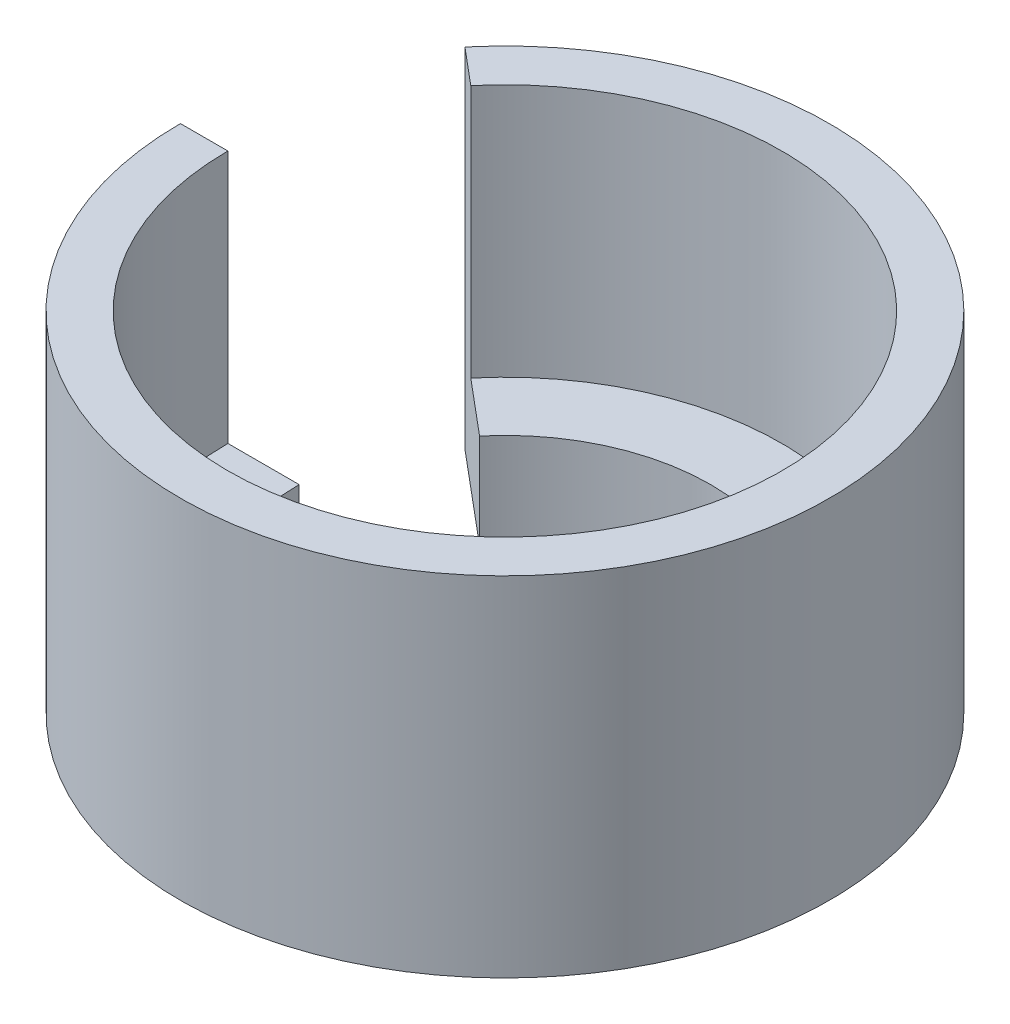
ISO-10303-21;
HEADER;
FILE_DESCRIPTION(('STEP AP214'),'2;1');
FILE_NAME('part.step','',(''),(''),'','','');
FILE_SCHEMA(('AUTOMOTIVE_DESIGN { 1 0 10303 214 1 1 1 1 }'));
ENDSEC;
DATA;
#1=APPLICATION_CONTEXT('core data for automotive mechanical design processes');
#2=APPLICATION_PROTOCOL_DEFINITION('international standard','automotive_design',2000,#1);
#3=PRODUCT_CONTEXT('',#1,'mechanical');
#4=PRODUCT('Part','Part','',(#3));
#5=PRODUCT_RELATED_PRODUCT_CATEGORY('part','',(#4));
#6=PRODUCT_DEFINITION_FORMATION('','',#4);
#7=PRODUCT_DEFINITION_CONTEXT('part definition',#1,'design');
#8=PRODUCT_DEFINITION('design','',#6,#7);
#9=PRODUCT_DEFINITION_SHAPE('','',#8);
#10=(LENGTH_UNIT() NAMED_UNIT(*) SI_UNIT(.MILLI.,.METRE.));
#11=(NAMED_UNIT(*) PLANE_ANGLE_UNIT() SI_UNIT($,.RADIAN.));
#12=(NAMED_UNIT(*) SI_UNIT($,.STERADIAN.) SOLID_ANGLE_UNIT());
#13=UNCERTAINTY_MEASURE_WITH_UNIT(LENGTH_MEASURE(1.E-05),#10,'distance_accuracy_value','');
#14=(GEOMETRIC_REPRESENTATION_CONTEXT(3) GLOBAL_UNCERTAINTY_ASSIGNED_CONTEXT((#13)) GLOBAL_UNIT_ASSIGNED_CONTEXT((#10,
#11,#12)) REPRESENTATION_CONTEXT('',''));
#15=CARTESIAN_POINT('',(0.,0.,0.));
#16=DIRECTION('',(0.,0.,1.));
#17=DIRECTION('',(1.,0.,0.));
#18=AXIS2_PLACEMENT_3D('',#15,#16,#17);
#19=CARTESIAN_POINT('',(-2.68115555091645,1.2,-2.24975663390286));
#20=DIRECTION('',(0.,-1.,0.));
#21=DIRECTION('',(0.,0.,-1.));
#22=AXIS2_PLACEMENT_3D('',#19,#20,#21);
#23=PLANE('',#22);
#24=CARTESIAN_POINT('',(0.,1.2,0.));
#25=DIRECTION('',(0.,-1.,0.));
#26=DIRECTION('',(0.,0.,-1.));
#27=AXIS2_PLACEMENT_3D('',#24,#25,#26);
#28=CIRCLE('',#27,2.6);
#29=CARTESIAN_POINT('',(-1.99171555210936,1.2,-1.67124778518498));
#30=VERTEX_POINT('',#29);
#31=CARTESIAN_POINT('',(-2.6,1.2,0.));
#32=VERTEX_POINT('',#31);
#33=EDGE_CURVE('E11',#30,#32,#28,.T.);
#34=ORIENTED_EDGE('',*,*,#33,.T.);
#35=DIRECTION('',(-1.,0.,0.));
#36=VECTOR('',#35,1.);
#37=CARTESIAN_POINT('',(-3.5,1.2,0.));
#38=LINE('',#37,#36);
#39=CARTESIAN_POINT('',(-3.5,1.2,0.));
#40=VERTEX_POINT('',#39);
#41=EDGE_CURVE('E100',#32,#40,#38,.T.);
#42=ORIENTED_EDGE('',*,*,#41,.T.);
#43=CARTESIAN_POINT('',(0.,1.2,0.));
#44=DIRECTION('',(0.,-1.,0.));
#45=DIRECTION('',(0.,0.,-1.));
#46=AXIS2_PLACEMENT_3D('',#43,#44,#45);
#47=CIRCLE('',#46,3.5);
#48=CARTESIAN_POINT('',(-2.68115555091645,1.2,-2.24975663390286));
#49=VERTEX_POINT('',#48);
#50=EDGE_CURVE('E82',#49,#40,#47,.T.);
#51=ORIENTED_EDGE('',*,*,#50,.F.);
#52=DIRECTION('',(-0.766044443118986,0.,-0.64278760968653));
#53=VECTOR('',#52,1.);
#54=CARTESIAN_POINT('',(-2.68115555091645,1.2,-2.24975663390286));
#55=LINE('',#54,#53);
#56=EDGE_CURVE('E115',#30,#49,#55,.T.);
#57=ORIENTED_EDGE('',*,*,#56,.F.);
#58=EDGE_LOOP('',(#34,#42,#51,#57));
#59=FACE_BOUND('',#58,.T.);
#60=ADVANCED_FACE('F30',(#59),#23,.F.);
#61=CARTESIAN_POINT('',(0.,0.,0.));
#62=DIRECTION('',(0.,-1.,0.));
#63=DIRECTION('',(0.,0.,-1.));
#64=AXIS2_PLACEMENT_3D('',#61,#62,#63);
#65=CYLINDRICAL_SURFACE('',#64,2.6);
#66=CARTESIAN_POINT('',(0.,0.,0.));
#67=DIRECTION('',(0.,-1.,0.));
#68=DIRECTION('',(0.,0.,-1.));
#69=AXIS2_PLACEMENT_3D('',#66,#67,#68);
#70=CIRCLE('',#69,2.6);
#71=CARTESIAN_POINT('',(-1.99171555210936,0.,-1.67124778518498));
#72=VERTEX_POINT('',#71);
#73=CARTESIAN_POINT('',(-2.6,0.,0.));
#74=VERTEX_POINT('',#73);
#75=EDGE_CURVE('E38',#72,#74,#70,.T.);
#76=ORIENTED_EDGE('',*,*,#75,.T.);
#77=DIRECTION('',(0.,1.,0.));
#78=VECTOR('',#77,1.);
#79=CARTESIAN_POINT('',(-2.6,1.2,0.));
#80=LINE('',#79,#78);
#81=EDGE_CURVE('E113',#74,#32,#80,.T.);
#82=ORIENTED_EDGE('',*,*,#81,.T.);
#83=ORIENTED_EDGE('',*,*,#33,.F.);
#84=DIRECTION('',(0.,1.,0.));
#85=VECTOR('',#84,1.);
#86=CARTESIAN_POINT('',(-1.99171555210936,1.2,-1.67124778518498));
#87=LINE('',#86,#85);
#88=EDGE_CURVE('E94',#72,#30,#87,.T.);
#89=ORIENTED_EDGE('',*,*,#88,.F.);
#90=EDGE_LOOP('',(#76,#82,#83,#89));
#91=FACE_BOUND('',#90,.T.);
#92=ADVANCED_FACE('F32',(#91),#65,.F.);
#93=CARTESIAN_POINT('',(-3.14078221678784,0.,-2.63542919971477));
#94=DIRECTION('',(0.,1.,0.));
#95=DIRECTION('',(0.,0.,1.));
#96=AXIS2_PLACEMENT_3D('',#93,#94,#95);
#97=PLANE('',#96);
#98=CARTESIAN_POINT('',(0.,0.,0.));
#99=DIRECTION('',(0.,-1.,0.));
#100=DIRECTION('',(0.,0.,-1.));
#101=AXIS2_PLACEMENT_3D('',#98,#99,#100);
#102=CIRCLE('',#101,4.1);
#103=CARTESIAN_POINT('',(-3.14078221678784,0.,-2.63542919971477));
#104=VERTEX_POINT('',#103);
#105=CARTESIAN_POINT('',(-4.1,0.,0.));
#106=VERTEX_POINT('',#105);
#107=EDGE_CURVE('E130',#104,#106,#102,.T.);
#108=ORIENTED_EDGE('',*,*,#107,.T.);
#109=DIRECTION('',(1.,0.,0.));
#110=VECTOR('',#109,1.);
#111=CARTESIAN_POINT('',(-4.1,0.,0.));
#112=LINE('',#111,#110);
#113=EDGE_CURVE('E111',#106,#74,#112,.T.);
#114=ORIENTED_EDGE('',*,*,#113,.T.);
#115=ORIENTED_EDGE('',*,*,#75,.F.);
#116=DIRECTION('',(0.766044443118986,0.,0.64278760968653));
#117=VECTOR('',#116,1.);
#118=CARTESIAN_POINT('',(-3.14078221678784,0.,-2.63542919971477));
#119=LINE('',#118,#117);
#120=EDGE_CURVE('E124',#104,#72,#119,.T.);
#121=ORIENTED_EDGE('',*,*,#120,.F.);
#122=EDGE_LOOP('',(#108,#114,#115,#121));
#123=FACE_BOUND('',#122,.T.);
#124=ADVANCED_FACE('F132',(#123),#97,.F.);
#125=CARTESIAN_POINT('',(0.,0.,0.));
#126=DIRECTION('',(0.,-1.,0.));
#127=DIRECTION('',(0.,0.,-1.));
#128=AXIS2_PLACEMENT_3D('',#125,#126,#127);
#129=CYLINDRICAL_SURFACE('',#128,4.1);
#130=CARTESIAN_POINT('',(0.,4.4,0.));
#131=DIRECTION('',(0.,-1.,0.));
#132=DIRECTION('',(0.,0.,-1.));
#133=AXIS2_PLACEMENT_3D('',#130,#131,#132);
#134=CIRCLE('',#133,4.1);
#135=CARTESIAN_POINT('',(-3.14078221678784,4.4,-2.63542919971477));
#136=VERTEX_POINT('',#135);
#137=CARTESIAN_POINT('',(-4.1,4.4,0.));
#138=VERTEX_POINT('',#137);
#139=EDGE_CURVE('E128',#136,#138,#134,.T.);
#140=ORIENTED_EDGE('',*,*,#139,.T.);
#141=DIRECTION('',(0.,-1.,0.));
#142=VECTOR('',#141,1.);
#143=CARTESIAN_POINT('',(-4.1,4.4,0.));
#144=LINE('',#143,#142);
#145=EDGE_CURVE('E108',#138,#106,#144,.T.);
#146=ORIENTED_EDGE('',*,*,#145,.T.);
#147=ORIENTED_EDGE('',*,*,#107,.F.);
#148=DIRECTION('',(0.,-1.,0.));
#149=VECTOR('',#148,1.);
#150=CARTESIAN_POINT('',(-3.14078221678784,4.4,-2.63542919971477));
#151=LINE('',#150,#149);
#152=EDGE_CURVE('E121',#136,#104,#151,.T.);
#153=ORIENTED_EDGE('',*,*,#152,.F.);
#154=EDGE_LOOP('',(#140,#146,#147,#153));
#155=FACE_BOUND('',#154,.T.);
#156=ADVANCED_FACE('F134',(#155),#129,.T.);
#157=CARTESIAN_POINT('',(-2.68115555091645,4.4,-2.24975663390286));
#158=DIRECTION('',(0.,-1.,0.));
#159=DIRECTION('',(0.,0.,-1.));
#160=AXIS2_PLACEMENT_3D('',#157,#158,#159);
#161=PLANE('',#160);
#162=CARTESIAN_POINT('',(0.,4.4,0.));
#163=DIRECTION('',(0.,-1.,0.));
#164=DIRECTION('',(0.,0.,-1.));
#165=AXIS2_PLACEMENT_3D('',#162,#163,#164);
#166=CIRCLE('',#165,3.5);
#167=CARTESIAN_POINT('',(-2.68115555091645,4.4,-2.24975663390286));
#168=VERTEX_POINT('',#167);
#169=CARTESIAN_POINT('',(-3.5,4.4,0.));
#170=VERTEX_POINT('',#169);
#171=EDGE_CURVE('E93',#168,#170,#166,.T.);
#172=ORIENTED_EDGE('',*,*,#171,.T.);
#173=DIRECTION('',(-1.,0.,0.));
#174=VECTOR('',#173,1.);
#175=CARTESIAN_POINT('',(-3.5,4.4,0.));
#176=LINE('',#175,#174);
#177=EDGE_CURVE('E103',#170,#138,#176,.T.);
#178=ORIENTED_EDGE('',*,*,#177,.T.);
#179=ORIENTED_EDGE('',*,*,#139,.F.);
#180=DIRECTION('',(-0.766044443118986,0.,-0.64278760968653));
#181=VECTOR('',#180,1.);
#182=CARTESIAN_POINT('',(-2.68115555091645,4.4,-2.24975663390286));
#183=LINE('',#182,#181);
#184=EDGE_CURVE('E118',#168,#136,#183,.T.);
#185=ORIENTED_EDGE('',*,*,#184,.F.);
#186=EDGE_LOOP('',(#172,#178,#179,#185));
#187=FACE_BOUND('',#186,.T.);
#188=ADVANCED_FACE('F138',(#187),#161,.F.);
#189=CARTESIAN_POINT('',(0.,0.,0.));
#190=DIRECTION('',(0.,-1.,0.));
#191=DIRECTION('',(0.,0.,-1.));
#192=AXIS2_PLACEMENT_3D('',#189,#190,#191);
#193=CYLINDRICAL_SURFACE('',#192,3.5);
#194=DIRECTION('',(0.,1.,0.));
#195=VECTOR('',#194,1.);
#196=CARTESIAN_POINT('',(-2.68115555091645,1.2,-2.24975663390286));
#197=LINE('',#196,#195);
#198=EDGE_CURVE('E88',#49,#168,#197,.T.);
#199=ORIENTED_EDGE('',*,*,#198,.F.);
#200=ORIENTED_EDGE('',*,*,#50,.T.);
#201=DIRECTION('',(0.,1.,0.));
#202=VECTOR('',#201,1.);
#203=CARTESIAN_POINT('',(-3.5,1.2,0.));
#204=LINE('',#203,#202);
#205=EDGE_CURVE('E85',#40,#170,#204,.T.);
#206=ORIENTED_EDGE('',*,*,#205,.T.);
#207=ORIENTED_EDGE('',*,*,#171,.F.);
#208=EDGE_LOOP('',(#199,#200,#206,#207));
#209=FACE_BOUND('',#208,.T.);
#210=ADVANCED_FACE('F84',(#209),#193,.F.);
#211=CARTESIAN_POINT('',(0.,0.,0.));
#212=DIRECTION('',(0.64278760968653,0.,-0.766044443118986));
#213=DIRECTION('',(-0.766044443118986,0.,-0.64278760968653));
#214=AXIS2_PLACEMENT_3D('',#211,#212,#213);
#215=PLANE('',#214);
#216=ORIENTED_EDGE('',*,*,#56,.T.);
#217=ORIENTED_EDGE('',*,*,#198,.T.);
#218=ORIENTED_EDGE('',*,*,#184,.T.);
#219=ORIENTED_EDGE('',*,*,#152,.T.);
#220=ORIENTED_EDGE('',*,*,#120,.T.);
#221=ORIENTED_EDGE('',*,*,#88,.T.);
#222=EDGE_LOOP('',(#216,#217,#218,#219,#220,#221));
#223=FACE_BOUND('',#222,.T.);
#224=ADVANCED_FACE('F140',(#223),#215,.F.);
#225=CARTESIAN_POINT('',(0.,0.,0.));
#226=DIRECTION('',(0.,0.,-1.));
#227=DIRECTION('',(-1.,0.,0.));
#228=AXIS2_PLACEMENT_3D('',#225,#226,#227);
#229=PLANE('',#228);
#230=ORIENTED_EDGE('',*,*,#41,.F.);
#231=ORIENTED_EDGE('',*,*,#81,.F.);
#232=ORIENTED_EDGE('',*,*,#113,.F.);
#233=ORIENTED_EDGE('',*,*,#145,.F.);
#234=ORIENTED_EDGE('',*,*,#177,.F.);
#235=ORIENTED_EDGE('',*,*,#205,.F.);
#236=EDGE_LOOP('',(#230,#231,#232,#233,#234,#235));
#237=FACE_BOUND('',#236,.T.);
#238=ADVANCED_FACE('F98',(#237),#229,.T.);
#239=CLOSED_SHELL('',(#60,#92,#124,#156,#188,#210,#224,#238));
#240=MANIFOLD_SOLID_BREP('B2',#239);
#241=ADVANCED_BREP_SHAPE_REPRESENTATION('',(#18,#240),#14);
#242=SHAPE_DEFINITION_REPRESENTATION(#9,#241);
ENDSEC;
END-ISO-10303-21;
